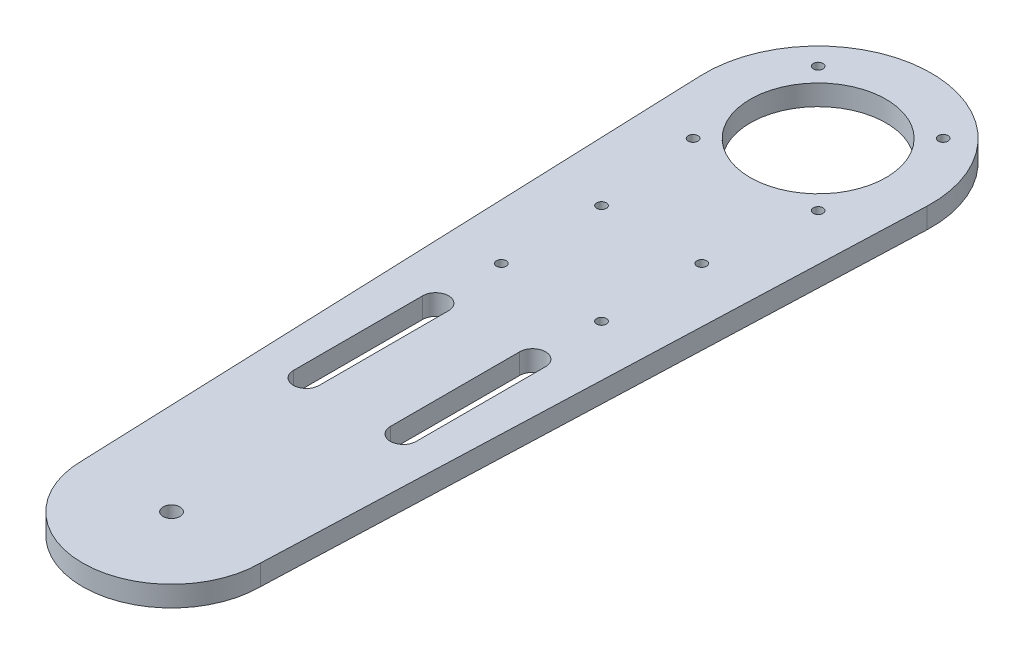
ISO-10303-21;
HEADER;
FILE_DESCRIPTION(('STEP AP214'),'2;1');
FILE_NAME('part.step','',(''),(''),'','','');
FILE_SCHEMA(('AUTOMOTIVE_DESIGN { 1 0 10303 214 1 1 1 1 }'));
ENDSEC;
DATA;
#1=APPLICATION_CONTEXT('core data for automotive mechanical design processes');
#2=APPLICATION_PROTOCOL_DEFINITION('international standard','automotive_design',2000,#1);
#3=PRODUCT_CONTEXT('',#1,'mechanical');
#4=PRODUCT('Part','Part','',(#3));
#5=PRODUCT_RELATED_PRODUCT_CATEGORY('part','',(#4));
#6=PRODUCT_DEFINITION_FORMATION('','',#4);
#7=PRODUCT_DEFINITION_CONTEXT('part definition',#1,'design');
#8=PRODUCT_DEFINITION('design','',#6,#7);
#9=PRODUCT_DEFINITION_SHAPE('','',#8);
#10=(LENGTH_UNIT() NAMED_UNIT(*) SI_UNIT(.MILLI.,.METRE.));
#11=(NAMED_UNIT(*) PLANE_ANGLE_UNIT() SI_UNIT($,.RADIAN.));
#12=(NAMED_UNIT(*) SI_UNIT($,.STERADIAN.) SOLID_ANGLE_UNIT());
#13=UNCERTAINTY_MEASURE_WITH_UNIT(LENGTH_MEASURE(1.E-05),#10,'distance_accuracy_value','');
#14=(GEOMETRIC_REPRESENTATION_CONTEXT(3) GLOBAL_UNCERTAINTY_ASSIGNED_CONTEXT((#13)) GLOBAL_UNIT_ASSIGNED_CONTEXT((#10,
#11,#12)) REPRESENTATION_CONTEXT('',''));
#15=CARTESIAN_POINT('',(0.,0.,0.));
#16=DIRECTION('',(0.,0.,1.));
#17=DIRECTION('',(1.,0.,0.));
#18=AXIS2_PLACEMENT_3D('',#15,#16,#17);
#19=CARTESIAN_POINT('',(27.4611273571522,6.35,1.03319242929476));
#20=DIRECTION('',(-0.999292974733131,0.,-0.0375972159741946));
#21=DIRECTION('',(-0.0375972159741946,0.,0.999292974733131));
#22=AXIS2_PLACEMENT_3D('',#19,#20,#21);
#23=PLANE('',#22);
#24=DIRECTION('',(0.0375972159741946,0.,-0.999292974733131));
#25=VECTOR('',#24,1.);
#26=CARTESIAN_POINT('',(27.4611273571522,0.,1.03319242929476));
#27=LINE('',#26,#25);
#28=CARTESIAN_POINT('',(27.5,0.,0.));
#29=VERTEX_POINT('',#28);
#30=CARTESIAN_POINT('',(34.9752541156596,0.,-198.684097440903));
#31=VERTEX_POINT('',#30);
#32=EDGE_CURVE('E271',#29,#31,#27,.T.);
#33=ORIENTED_EDGE('',*,*,#32,.T.);
#34=DIRECTION('',(0.,-1.,0.));
#35=VECTOR('',#34,1.);
#36=CARTESIAN_POINT('',(34.9752541156596,6.35,-198.684097440903));
#37=LINE('',#36,#35);
#38=CARTESIAN_POINT('',(34.9752541156596,6.35,-198.684097440903));
#39=VERTEX_POINT('',#38);
#40=EDGE_CURVE('E11',#39,#31,#37,.T.);
#41=ORIENTED_EDGE('',*,*,#40,.F.);
#42=DIRECTION('',(0.0375972159741946,0.,-0.999292974733131));
#43=VECTOR('',#42,1.);
#44=CARTESIAN_POINT('',(27.4611273571522,6.35,1.03319242929476));
#45=LINE('',#44,#43);
#46=CARTESIAN_POINT('',(27.5,6.35,0.));
#47=VERTEX_POINT('',#46);
#48=EDGE_CURVE('E275',#47,#39,#45,.T.);
#49=ORIENTED_EDGE('',*,*,#48,.F.);
#50=DIRECTION('',(0.,-1.,0.));
#51=VECTOR('',#50,1.);
#52=CARTESIAN_POINT('',(27.5,6.35,0.));
#53=LINE('',#52,#51);
#54=EDGE_CURVE('E290',#47,#29,#53,.T.);
#55=ORIENTED_EDGE('',*,*,#54,.T.);
#56=EDGE_LOOP('',(#33,#41,#49,#55));
#57=FACE_BOUND('',#56,.T.);
#58=ADVANCED_FACE('F40',(#57),#23,.F.);
#59=CARTESIAN_POINT('',(0.,6.35,-200.));
#60=DIRECTION('',(0.,-1.,0.));
#61=DIRECTION('',(0.,0.,-1.));
#62=AXIS2_PLACEMENT_3D('',#59,#60,#61);
#63=CYLINDRICAL_SURFACE('',#62,35.);
#64=CARTESIAN_POINT('',(0.,0.,-200.));
#65=DIRECTION('',(0.,1.,0.));
#66=DIRECTION('',(0.,0.,1.));
#67=AXIS2_PLACEMENT_3D('',#64,#65,#66);
#68=CIRCLE('',#67,35.);
#69=CARTESIAN_POINT('',(-34.9752541156596,0.,-198.684097440903));
#70=VERTEX_POINT('',#69);
#71=EDGE_CURVE('E294',#31,#70,#68,.T.);
#72=ORIENTED_EDGE('',*,*,#71,.T.);
#73=DIRECTION('',(0.,-1.,0.));
#74=VECTOR('',#73,1.);
#75=CARTESIAN_POINT('',(-34.9752541156596,6.35,-198.684097440903));
#76=LINE('',#75,#74);
#77=CARTESIAN_POINT('',(-34.9752541156596,6.35,-198.684097440903));
#78=VERTEX_POINT('',#77);
#79=EDGE_CURVE('E48',#78,#70,#76,.T.);
#80=ORIENTED_EDGE('',*,*,#79,.F.);
#81=CARTESIAN_POINT('',(0.,6.35,-200.));
#82=DIRECTION('',(0.,1.,0.));
#83=DIRECTION('',(0.,0.,1.));
#84=AXIS2_PLACEMENT_3D('',#81,#82,#83);
#85=CIRCLE('',#84,35.);
#86=EDGE_CURVE('E279',#39,#78,#85,.T.);
#87=ORIENTED_EDGE('',*,*,#86,.F.);
#88=ORIENTED_EDGE('',*,*,#40,.T.);
#89=EDGE_LOOP('',(#72,#80,#87,#88));
#90=FACE_BOUND('',#89,.T.);
#91=ADVANCED_FACE('F316',(#90),#63,.T.);
#92=CARTESIAN_POINT('',(-27.4611273571522,6.35,1.03319242929476));
#93=DIRECTION('',(-0.999292974733131,0.,0.0375972159741946));
#94=DIRECTION('',(0.0375972159741946,0.,0.999292974733131));
#95=AXIS2_PLACEMENT_3D('',#92,#93,#94);
#96=PLANE('',#95);
#97=DIRECTION('',(-0.0375972159741946,0.,-0.999292974733131));
#98=VECTOR('',#97,1.);
#99=CARTESIAN_POINT('',(-27.4611273571522,0.,1.03319242929476));
#100=LINE('',#99,#98);
#101=CARTESIAN_POINT('',(-27.5,0.,0.));
#102=VERTEX_POINT('',#101);
#103=EDGE_CURVE('E298',#102,#70,#100,.T.);
#104=ORIENTED_EDGE('',*,*,#103,.F.);
#105=DIRECTION('',(0.,-1.,0.));
#106=VECTOR('',#105,1.);
#107=CARTESIAN_POINT('',(-27.5,6.35,0.));
#108=LINE('',#107,#106);
#109=CARTESIAN_POINT('',(-27.5,6.35,0.));
#110=VERTEX_POINT('',#109);
#111=EDGE_CURVE('E307',#110,#102,#108,.T.);
#112=ORIENTED_EDGE('',*,*,#111,.F.);
#113=DIRECTION('',(-0.0375972159741946,0.,-0.999292974733131));
#114=VECTOR('',#113,1.);
#115=CARTESIAN_POINT('',(-27.4611273571522,6.35,1.03319242929476));
#116=LINE('',#115,#114);
#117=EDGE_CURVE('E283',#110,#78,#116,.T.);
#118=ORIENTED_EDGE('',*,*,#117,.T.);
#119=ORIENTED_EDGE('',*,*,#79,.T.);
#120=EDGE_LOOP('',(#104,#112,#118,#119));
#121=FACE_BOUND('',#120,.T.);
#122=ADVANCED_FACE('F313',(#121),#96,.T.);
#123=CARTESIAN_POINT('',(0.,6.35,0.));
#124=DIRECTION('',(0.,-1.,0.));
#125=DIRECTION('',(0.,0.,-1.));
#126=AXIS2_PLACEMENT_3D('',#123,#124,#125);
#127=CYLINDRICAL_SURFACE('',#126,27.5);
#128=CARTESIAN_POINT('',(0.,0.,0.));
#129=DIRECTION('',(0.,1.,0.));
#130=DIRECTION('',(0.,0.,1.));
#131=AXIS2_PLACEMENT_3D('',#128,#129,#130);
#132=CIRCLE('',#131,27.5);
#133=EDGE_CURVE('E280',#102,#29,#132,.T.);
#134=ORIENTED_EDGE('',*,*,#133,.T.);
#135=ORIENTED_EDGE('',*,*,#54,.F.);
#136=CARTESIAN_POINT('',(0.,6.35,0.));
#137=DIRECTION('',(0.,1.,0.));
#138=DIRECTION('',(0.,0.,1.));
#139=AXIS2_PLACEMENT_3D('',#136,#137,#138);
#140=CIRCLE('',#139,27.5);
#141=EDGE_CURVE('E287',#110,#47,#140,.T.);
#142=ORIENTED_EDGE('',*,*,#141,.F.);
#143=ORIENTED_EDGE('',*,*,#111,.T.);
#144=EDGE_LOOP('',(#134,#135,#142,#143));
#145=FACE_BOUND('',#144,.T.);
#146=ADVANCED_FACE('F323',(#145),#127,.T.);
#147=CARTESIAN_POINT('',(0.,6.35,0.));
#148=DIRECTION('',(0.,1.,0.));
#149=DIRECTION('',(0.,0.,1.));
#150=AXIS2_PLACEMENT_3D('',#147,#148,#149);
#151=PLANE('',#150);
#152=CARTESIAN_POINT('',(-15.5,6.35,-117.5));
#153=DIRECTION('',(0.,-1.,0.));
#154=DIRECTION('',(0.,0.,-1.));
#155=AXIS2_PLACEMENT_3D('',#152,#153,#154);
#156=CIRCLE('',#155,1.5);
#157=CARTESIAN_POINT('',(-15.5,6.35,-119.));
#158=VERTEX_POINT('',#157);
#159=EDGE_CURVE('E544',#158,#158,#156,.T.);
#160=ORIENTED_EDGE('',*,*,#159,.T.);
#161=EDGE_LOOP('',(#160));
#162=FACE_BOUND('',#161,.T.);
#163=CARTESIAN_POINT('',(-15.5,6.35,-148.5));
#164=DIRECTION('',(0.,-1.,0.));
#165=DIRECTION('',(0.,0.,-1.));
#166=AXIS2_PLACEMENT_3D('',#163,#164,#165);
#167=CIRCLE('',#166,1.5);
#168=CARTESIAN_POINT('',(-15.5,6.35,-150.));
#169=VERTEX_POINT('',#168);
#170=EDGE_CURVE('E571',#169,#169,#167,.T.);
#171=ORIENTED_EDGE('',*,*,#170,.T.);
#172=EDGE_LOOP('',(#171));
#173=FACE_BOUND('',#172,.T.);
#174=CARTESIAN_POINT('',(15.5,6.35,-148.5));
#175=DIRECTION('',(0.,-1.,0.));
#176=DIRECTION('',(0.,0.,-1.));
#177=AXIS2_PLACEMENT_3D('',#174,#175,#176);
#178=CIRCLE('',#177,1.5);
#179=CARTESIAN_POINT('',(15.5,6.35,-150.));
#180=VERTEX_POINT('',#179);
#181=EDGE_CURVE('E560',#180,#180,#178,.T.);
#182=ORIENTED_EDGE('',*,*,#181,.T.);
#183=EDGE_LOOP('',(#182));
#184=FACE_BOUND('',#183,.T.);
#185=CARTESIAN_POINT('',(15.5,6.35,-117.5));
#186=DIRECTION('',(0.,-1.,0.));
#187=DIRECTION('',(0.,0.,-1.));
#188=AXIS2_PLACEMENT_3D('',#185,#186,#187);
#189=CIRCLE('',#188,1.5);
#190=CARTESIAN_POINT('',(15.5,6.35,-119.));
#191=VERTEX_POINT('',#190);
#192=EDGE_CURVE('E206',#191,#191,#189,.T.);
#193=ORIENTED_EDGE('',*,*,#192,.T.);
#194=EDGE_LOOP('',(#193));
#195=FACE_BOUND('',#194,.T.);
#196=CARTESIAN_POINT('',(-15.,6.35,-56.6999999999999));
#197=DIRECTION('',(0.,1.,0.));
#198=DIRECTION('',(0.,0.,1.));
#199=AXIS2_PLACEMENT_3D('',#196,#197,#198);
#200=CIRCLE('',#199,4.00000000000001);
#201=CARTESIAN_POINT('',(-19.,6.35,-56.6999999999999));
#202=VERTEX_POINT('',#201);
#203=CARTESIAN_POINT('',(-11.,6.35,-56.6999999999999));
#204=VERTEX_POINT('',#203);
#205=EDGE_CURVE('E55',#202,#204,#200,.T.);
#206=ORIENTED_EDGE('',*,*,#205,.F.);
#207=DIRECTION('',(0.,0.,1.));
#208=VECTOR('',#207,1.);
#209=CARTESIAN_POINT('',(-19.,6.35,-56.6999999999999));
#210=LINE('',#209,#208);
#211=CARTESIAN_POINT('',(-19.,6.35,-96.6999999999999));
#212=VERTEX_POINT('',#211);
#213=EDGE_CURVE('E153',#212,#202,#210,.T.);
#214=ORIENTED_EDGE('',*,*,#213,.F.);
#215=CARTESIAN_POINT('',(-15.,6.35,-96.6999999999999));
#216=DIRECTION('',(0.,1.,0.));
#217=DIRECTION('',(0.,0.,1.));
#218=AXIS2_PLACEMENT_3D('',#215,#216,#217);
#219=CIRCLE('',#218,4.00000000000001);
#220=CARTESIAN_POINT('',(-11.,6.35,-96.6999999999999));
#221=VERTEX_POINT('',#220);
#222=EDGE_CURVE('E157',#221,#212,#219,.T.);
#223=ORIENTED_EDGE('',*,*,#222,.F.);
#224=DIRECTION('',(0.,0.,-1.));
#225=VECTOR('',#224,1.);
#226=CARTESIAN_POINT('',(-11.,6.35,-56.6999999999999));
#227=LINE('',#226,#225);
#228=EDGE_CURVE('E169',#204,#221,#227,.T.);
#229=ORIENTED_EDGE('',*,*,#228,.F.);
#230=EDGE_LOOP('',(#206,#214,#223,#229));
#231=FACE_BOUND('',#230,.T.);
#232=CARTESIAN_POINT('',(15.,6.35,-56.6999999999999));
#233=DIRECTION('',(0.,1.,0.));
#234=DIRECTION('',(0.,0.,1.));
#235=AXIS2_PLACEMENT_3D('',#232,#233,#234);
#236=CIRCLE('',#235,3.99999999999999);
#237=CARTESIAN_POINT('',(11.,6.35,-56.6999999999999));
#238=VERTEX_POINT('',#237);
#239=CARTESIAN_POINT('',(19.,6.35,-56.6999999999999));
#240=VERTEX_POINT('',#239);
#241=EDGE_CURVE('E63',#238,#240,#236,.T.);
#242=ORIENTED_EDGE('',*,*,#241,.F.);
#243=DIRECTION('',(0.,0.,1.));
#244=VECTOR('',#243,1.);
#245=CARTESIAN_POINT('',(11.,6.35,-56.6999999999999));
#246=LINE('',#245,#244);
#247=CARTESIAN_POINT('',(11.,6.35,-96.6999999999999));
#248=VERTEX_POINT('',#247);
#249=EDGE_CURVE('E190',#248,#238,#246,.T.);
#250=ORIENTED_EDGE('',*,*,#249,.F.);
#251=CARTESIAN_POINT('',(15.,6.35,-96.6999999999999));
#252=DIRECTION('',(0.,1.,0.));
#253=DIRECTION('',(0.,0.,1.));
#254=AXIS2_PLACEMENT_3D('',#251,#252,#253);
#255=CIRCLE('',#254,3.99999999999999);
#256=CARTESIAN_POINT('',(19.,6.35,-96.6999999999999));
#257=VERTEX_POINT('',#256);
#258=EDGE_CURVE('E210',#257,#248,#255,.T.);
#259=ORIENTED_EDGE('',*,*,#258,.F.);
#260=DIRECTION('',(0.,0.,-1.));
#261=VECTOR('',#260,1.);
#262=CARTESIAN_POINT('',(19.,6.35,-56.6999999999999));
#263=LINE('',#262,#261);
#264=EDGE_CURVE('E205',#240,#257,#263,.T.);
#265=ORIENTED_EDGE('',*,*,#264,.F.);
#266=EDGE_LOOP('',(#242,#250,#259,#265));
#267=FACE_BOUND('',#266,.T.);
#268=CARTESIAN_POINT('',(-19.3393704654521,6.35,-180.660629534548));
#269=DIRECTION('',(0.,1.,0.));
#270=DIRECTION('',(0.,0.,1.));
#271=AXIS2_PLACEMENT_3D('',#268,#269,#270);
#272=CIRCLE('',#271,1.5);
#273=CARTESIAN_POINT('',(-19.3393704654521,6.35,-179.160629534548));
#274=VERTEX_POINT('',#273);
#275=EDGE_CURVE('E179',#274,#274,#272,.T.);
#276=ORIENTED_EDGE('',*,*,#275,.F.);
#277=EDGE_LOOP('',(#276));
#278=FACE_BOUND('',#277,.T.);
#279=CARTESIAN_POINT('',(19.3393704654521,6.35,-180.660629534548));
#280=DIRECTION('',(0.,1.,0.));
#281=DIRECTION('',(0.,0.,1.));
#282=AXIS2_PLACEMENT_3D('',#279,#280,#281);
#283=CIRCLE('',#282,1.5);
#284=CARTESIAN_POINT('',(19.3393704654521,6.35,-179.160629534548));
#285=VERTEX_POINT('',#284);
#286=EDGE_CURVE('E240',#285,#285,#283,.T.);
#287=ORIENTED_EDGE('',*,*,#286,.F.);
#288=EDGE_LOOP('',(#287));
#289=FACE_BOUND('',#288,.T.);
#290=CARTESIAN_POINT('',(19.3393704654521,6.35,-219.339370465452));
#291=DIRECTION('',(0.,1.,0.));
#292=DIRECTION('',(0.,0.,1.));
#293=AXIS2_PLACEMENT_3D('',#290,#291,#292);
#294=CIRCLE('',#293,1.5);
#295=CARTESIAN_POINT('',(19.3393704654521,6.35,-217.839370465452));
#296=VERTEX_POINT('',#295);
#297=EDGE_CURVE('E232',#296,#296,#294,.T.);
#298=ORIENTED_EDGE('',*,*,#297,.F.);
#299=EDGE_LOOP('',(#298));
#300=FACE_BOUND('',#299,.T.);
#301=CARTESIAN_POINT('',(-19.3393704654521,6.35,-219.339370465452));
#302=DIRECTION('',(0.,1.,0.));
#303=DIRECTION('',(0.,0.,1.));
#304=AXIS2_PLACEMENT_3D('',#301,#302,#303);
#305=CIRCLE('',#304,1.5);
#306=CARTESIAN_POINT('',(-19.3393704654521,6.35,-217.839370465452));
#307=VERTEX_POINT('',#306);
#308=EDGE_CURVE('E231',#307,#307,#305,.T.);
#309=ORIENTED_EDGE('',*,*,#308,.F.);
#310=EDGE_LOOP('',(#309));
#311=FACE_BOUND('',#310,.T.);
#312=CARTESIAN_POINT('',(0.,6.35,-200.));
#313=DIRECTION('',(0.,1.,0.));
#314=DIRECTION('',(0.,0.,1.));
#315=AXIS2_PLACEMENT_3D('',#312,#313,#314);
#316=CIRCLE('',#315,21.);
#317=CARTESIAN_POINT('',(0.,6.35,-179.));
#318=VERTEX_POINT('',#317);
#319=EDGE_CURVE('E255',#318,#318,#316,.T.);
#320=ORIENTED_EDGE('',*,*,#319,.F.);
#321=EDGE_LOOP('',(#320));
#322=FACE_BOUND('',#321,.T.);
#323=CARTESIAN_POINT('',(0.,6.35,0.));
#324=DIRECTION('',(0.,1.,0.));
#325=DIRECTION('',(0.,0.,1.));
#326=AXIS2_PLACEMENT_3D('',#323,#324,#325);
#327=CIRCLE('',#326,2.6);
#328=CARTESIAN_POINT('',(0.,6.35,2.6));
#329=VERTEX_POINT('',#328);
#330=EDGE_CURVE('E263',#329,#329,#327,.T.);
#331=ORIENTED_EDGE('',*,*,#330,.F.);
#332=EDGE_LOOP('',(#331));
#333=FACE_BOUND('',#332,.T.);
#334=ORIENTED_EDGE('',*,*,#48,.T.);
#335=ORIENTED_EDGE('',*,*,#86,.T.);
#336=ORIENTED_EDGE('',*,*,#117,.F.);
#337=ORIENTED_EDGE('',*,*,#141,.T.);
#338=EDGE_LOOP('',(#334,#335,#336,#337));
#339=FACE_BOUND('',#338,.T.);
#340=ADVANCED_FACE('F328',(#162,#173,#184,#195,#231,#267,#278,#289,#300,#311,#322,#333,#339),
#151,.T.);
#341=CARTESIAN_POINT('',(0.,0.,0.));
#342=DIRECTION('',(0.,1.,0.));
#343=DIRECTION('',(0.,0.,1.));
#344=AXIS2_PLACEMENT_3D('',#341,#342,#343);
#345=PLANE('',#344);
#346=CARTESIAN_POINT('',(-15.5,0.,-117.5));
#347=DIRECTION('',(0.,-1.,0.));
#348=DIRECTION('',(0.,0.,-1.));
#349=AXIS2_PLACEMENT_3D('',#346,#347,#348);
#350=CIRCLE('',#349,1.5);
#351=CARTESIAN_POINT('',(-15.5,0.,-119.));
#352=VERTEX_POINT('',#351);
#353=EDGE_CURVE('E547',#352,#352,#350,.T.);
#354=ORIENTED_EDGE('',*,*,#353,.F.);
#355=EDGE_LOOP('',(#354));
#356=FACE_BOUND('',#355,.T.);
#357=CARTESIAN_POINT('',(-15.5,0.,-148.5));
#358=DIRECTION('',(0.,-1.,0.));
#359=DIRECTION('',(0.,0.,-1.));
#360=AXIS2_PLACEMENT_3D('',#357,#358,#359);
#361=CIRCLE('',#360,1.5);
#362=CARTESIAN_POINT('',(-15.5,0.,-150.));
#363=VERTEX_POINT('',#362);
#364=EDGE_CURVE('E551',#363,#363,#361,.T.);
#365=ORIENTED_EDGE('',*,*,#364,.F.);
#366=EDGE_LOOP('',(#365));
#367=FACE_BOUND('',#366,.T.);
#368=CARTESIAN_POINT('',(15.5,0.,-148.5));
#369=DIRECTION('',(0.,-1.,0.));
#370=DIRECTION('',(0.,0.,-1.));
#371=AXIS2_PLACEMENT_3D('',#368,#369,#370);
#372=CIRCLE('',#371,1.5);
#373=CARTESIAN_POINT('',(15.5,0.,-150.));
#374=VERTEX_POINT('',#373);
#375=EDGE_CURVE('E565',#374,#374,#372,.T.);
#376=ORIENTED_EDGE('',*,*,#375,.F.);
#377=EDGE_LOOP('',(#376));
#378=FACE_BOUND('',#377,.T.);
#379=CARTESIAN_POINT('',(15.5,0.,-117.5));
#380=DIRECTION('',(0.,-1.,0.));
#381=DIRECTION('',(0.,0.,-1.));
#382=AXIS2_PLACEMENT_3D('',#379,#380,#381);
#383=CIRCLE('',#382,1.5);
#384=CARTESIAN_POINT('',(15.5,0.,-119.));
#385=VERTEX_POINT('',#384);
#386=EDGE_CURVE('E160',#385,#385,#383,.T.);
#387=ORIENTED_EDGE('',*,*,#386,.F.);
#388=EDGE_LOOP('',(#387));
#389=FACE_BOUND('',#388,.T.);
#390=DIRECTION('',(0.,0.,1.));
#391=VECTOR('',#390,1.);
#392=CARTESIAN_POINT('',(-19.,0.,-56.6999999999999));
#393=LINE('',#392,#391);
#394=CARTESIAN_POINT('',(-19.,0.,-96.6999999999999));
#395=VERTEX_POINT('',#394);
#396=CARTESIAN_POINT('',(-19.,0.,-56.6999999999999));
#397=VERTEX_POINT('',#396);
#398=EDGE_CURVE('E138',#395,#397,#393,.T.);
#399=ORIENTED_EDGE('',*,*,#398,.T.);
#400=CARTESIAN_POINT('',(-15.,0.,-56.6999999999999));
#401=DIRECTION('',(0.,1.,0.));
#402=DIRECTION('',(0.,0.,1.));
#403=AXIS2_PLACEMENT_3D('',#400,#401,#402);
#404=CIRCLE('',#403,4.00000000000001);
#405=CARTESIAN_POINT('',(-11.,0.,-56.6999999999999));
#406=VERTEX_POINT('',#405);
#407=EDGE_CURVE('E131',#397,#406,#404,.T.);
#408=ORIENTED_EDGE('',*,*,#407,.T.);
#409=DIRECTION('',(0.,0.,-1.));
#410=VECTOR('',#409,1.);
#411=CARTESIAN_POINT('',(-11.,0.,-56.6999999999999));
#412=LINE('',#411,#410);
#413=CARTESIAN_POINT('',(-11.,0.,-96.6999999999999));
#414=VERTEX_POINT('',#413);
#415=EDGE_CURVE('E142',#406,#414,#412,.T.);
#416=ORIENTED_EDGE('',*,*,#415,.T.);
#417=CARTESIAN_POINT('',(-15.,0.,-96.6999999999999));
#418=DIRECTION('',(0.,1.,0.));
#419=DIRECTION('',(0.,0.,1.));
#420=AXIS2_PLACEMENT_3D('',#417,#418,#419);
#421=CIRCLE('',#420,4.00000000000001);
#422=EDGE_CURVE('E147',#414,#395,#421,.T.);
#423=ORIENTED_EDGE('',*,*,#422,.T.);
#424=EDGE_LOOP('',(#399,#408,#416,#423));
#425=FACE_BOUND('',#424,.T.);
#426=DIRECTION('',(0.,0.,1.));
#427=VECTOR('',#426,1.);
#428=CARTESIAN_POINT('',(11.,0.,-56.6999999999999));
#429=LINE('',#428,#427);
#430=CARTESIAN_POINT('',(11.,0.,-96.6999999999999));
#431=VERTEX_POINT('',#430);
#432=CARTESIAN_POINT('',(11.,0.,-56.6999999999999));
#433=VERTEX_POINT('',#432);
#434=EDGE_CURVE('E198',#431,#433,#429,.T.);
#435=ORIENTED_EDGE('',*,*,#434,.T.);
#436=CARTESIAN_POINT('',(15.,0.,-56.6999999999999));
#437=DIRECTION('',(0.,1.,0.));
#438=DIRECTION('',(0.,0.,1.));
#439=AXIS2_PLACEMENT_3D('',#436,#437,#438);
#440=CIRCLE('',#439,3.99999999999999);
#441=CARTESIAN_POINT('',(19.,0.,-56.6999999999999));
#442=VERTEX_POINT('',#441);
#443=EDGE_CURVE('E185',#433,#442,#440,.T.);
#444=ORIENTED_EDGE('',*,*,#443,.T.);
#445=DIRECTION('',(0.,0.,-1.));
#446=VECTOR('',#445,1.);
#447=CARTESIAN_POINT('',(19.,0.,-56.6999999999999));
#448=LINE('',#447,#446);
#449=CARTESIAN_POINT('',(19.,0.,-96.6999999999999));
#450=VERTEX_POINT('',#449);
#451=EDGE_CURVE('E189',#442,#450,#448,.T.);
#452=ORIENTED_EDGE('',*,*,#451,.T.);
#453=CARTESIAN_POINT('',(15.,0.,-96.6999999999999));
#454=DIRECTION('',(0.,1.,0.));
#455=DIRECTION('',(0.,0.,1.));
#456=AXIS2_PLACEMENT_3D('',#453,#454,#455);
#457=CIRCLE('',#456,3.99999999999999);
#458=EDGE_CURVE('E194',#450,#431,#457,.T.);
#459=ORIENTED_EDGE('',*,*,#458,.T.);
#460=EDGE_LOOP('',(#435,#444,#452,#459));
#461=FACE_BOUND('',#460,.T.);
#462=CARTESIAN_POINT('',(-19.3393704654521,0.,-180.660629534548));
#463=DIRECTION('',(0.,1.,0.));
#464=DIRECTION('',(0.,0.,1.));
#465=AXIS2_PLACEMENT_3D('',#462,#463,#464);
#466=CIRCLE('',#465,1.5);
#467=CARTESIAN_POINT('',(-19.3393704654521,0.,-179.160629534548));
#468=VERTEX_POINT('',#467);
#469=EDGE_CURVE('E244',#468,#468,#466,.T.);
#470=ORIENTED_EDGE('',*,*,#469,.T.);
#471=EDGE_LOOP('',(#470));
#472=FACE_BOUND('',#471,.T.);
#473=CARTESIAN_POINT('',(19.3393704654521,0.,-180.660629534548));
#474=DIRECTION('',(0.,1.,0.));
#475=DIRECTION('',(0.,0.,1.));
#476=AXIS2_PLACEMENT_3D('',#473,#474,#475);
#477=CIRCLE('',#476,1.5);
#478=CARTESIAN_POINT('',(19.3393704654521,0.,-179.160629534548));
#479=VERTEX_POINT('',#478);
#480=EDGE_CURVE('E236',#479,#479,#477,.T.);
#481=ORIENTED_EDGE('',*,*,#480,.T.);
#482=EDGE_LOOP('',(#481));
#483=FACE_BOUND('',#482,.T.);
#484=CARTESIAN_POINT('',(19.3393704654521,0.,-219.339370465452));
#485=DIRECTION('',(0.,1.,0.));
#486=DIRECTION('',(0.,0.,1.));
#487=AXIS2_PLACEMENT_3D('',#484,#485,#486);
#488=CIRCLE('',#487,1.5);
#489=CARTESIAN_POINT('',(19.3393704654521,0.,-217.839370465452));
#490=VERTEX_POINT('',#489);
#491=EDGE_CURVE('E227',#490,#490,#488,.T.);
#492=ORIENTED_EDGE('',*,*,#491,.T.);
#493=EDGE_LOOP('',(#492));
#494=FACE_BOUND('',#493,.T.);
#495=CARTESIAN_POINT('',(-19.3393704654521,0.,-219.339370465452));
#496=DIRECTION('',(0.,1.,0.));
#497=DIRECTION('',(0.,0.,1.));
#498=AXIS2_PLACEMENT_3D('',#495,#496,#497);
#499=CIRCLE('',#498,1.5);
#500=CARTESIAN_POINT('',(-19.3393704654521,0.,-217.839370465452));
#501=VERTEX_POINT('',#500);
#502=EDGE_CURVE('E251',#501,#501,#499,.T.);
#503=ORIENTED_EDGE('',*,*,#502,.T.);
#504=EDGE_LOOP('',(#503));
#505=FACE_BOUND('',#504,.T.);
#506=CARTESIAN_POINT('',(0.,0.,-200.));
#507=DIRECTION('',(0.,1.,0.));
#508=DIRECTION('',(0.,0.,1.));
#509=AXIS2_PLACEMENT_3D('',#506,#507,#508);
#510=CIRCLE('',#509,21.);
#511=CARTESIAN_POINT('',(0.,0.,-179.));
#512=VERTEX_POINT('',#511);
#513=EDGE_CURVE('E259',#512,#512,#510,.T.);
#514=ORIENTED_EDGE('',*,*,#513,.T.);
#515=EDGE_LOOP('',(#514));
#516=FACE_BOUND('',#515,.T.);
#517=CARTESIAN_POINT('',(0.,0.,0.));
#518=DIRECTION('',(0.,1.,0.));
#519=DIRECTION('',(0.,0.,1.));
#520=AXIS2_PLACEMENT_3D('',#517,#518,#519);
#521=CIRCLE('',#520,2.6);
#522=CARTESIAN_POINT('',(0.,0.,2.6));
#523=VERTEX_POINT('',#522);
#524=EDGE_CURVE('E267',#523,#523,#521,.T.);
#525=ORIENTED_EDGE('',*,*,#524,.T.);
#526=EDGE_LOOP('',(#525));
#527=FACE_BOUND('',#526,.T.);
#528=ORIENTED_EDGE('',*,*,#32,.F.);
#529=ORIENTED_EDGE('',*,*,#133,.F.);
#530=ORIENTED_EDGE('',*,*,#103,.T.);
#531=ORIENTED_EDGE('',*,*,#71,.F.);
#532=EDGE_LOOP('',(#528,#529,#530,#531));
#533=FACE_BOUND('',#532,.T.);
#534=ADVANCED_FACE('F149',(#356,#367,#378,#389,#425,#461,#472,#483,#494,#505,#516,#527,#533),
#345,.F.);
#535=CARTESIAN_POINT('',(0.,0.,0.));
#536=DIRECTION('',(0.,1.,0.));
#537=DIRECTION('',(0.,0.,1.));
#538=AXIS2_PLACEMENT_3D('',#535,#536,#537);
#539=CYLINDRICAL_SURFACE('',#538,2.6);
#540=ORIENTED_EDGE('',*,*,#524,.F.);
#541=EDGE_LOOP('',(#540));
#542=FACE_BOUND('',#541,.T.);
#543=ORIENTED_EDGE('',*,*,#330,.T.);
#544=EDGE_LOOP('',(#543));
#545=FACE_BOUND('',#544,.T.);
#546=ADVANCED_FACE('F336',(#542,#545),#539,.F.);
#547=CARTESIAN_POINT('',(0.,0.,-200.));
#548=DIRECTION('',(0.,1.,0.));
#549=DIRECTION('',(0.,0.,1.));
#550=AXIS2_PLACEMENT_3D('',#547,#548,#549);
#551=CYLINDRICAL_SURFACE('',#550,21.);
#552=ORIENTED_EDGE('',*,*,#513,.F.);
#553=EDGE_LOOP('',(#552));
#554=FACE_BOUND('',#553,.T.);
#555=ORIENTED_EDGE('',*,*,#319,.T.);
#556=EDGE_LOOP('',(#555));
#557=FACE_BOUND('',#556,.T.);
#558=ADVANCED_FACE('F376',(#554,#557),#551,.F.);
#559=CARTESIAN_POINT('',(-19.3393704654521,0.,-219.339370465452));
#560=DIRECTION('',(0.,1.,0.));
#561=DIRECTION('',(0.,0.,1.));
#562=AXIS2_PLACEMENT_3D('',#559,#560,#561);
#563=CYLINDRICAL_SURFACE('',#562,1.5);
#564=ORIENTED_EDGE('',*,*,#502,.F.);
#565=EDGE_LOOP('',(#564));
#566=FACE_BOUND('',#565,.T.);
#567=ORIENTED_EDGE('',*,*,#308,.T.);
#568=EDGE_LOOP('',(#567));
#569=FACE_BOUND('',#568,.T.);
#570=ADVANCED_FACE('F382',(#566,#569),#563,.F.);
#571=CARTESIAN_POINT('',(19.3393704654521,0.,-219.339370465452));
#572=DIRECTION('',(0.,1.,0.));
#573=DIRECTION('',(0.,0.,1.));
#574=AXIS2_PLACEMENT_3D('',#571,#572,#573);
#575=CYLINDRICAL_SURFACE('',#574,1.5);
#576=ORIENTED_EDGE('',*,*,#491,.F.);
#577=EDGE_LOOP('',(#576));
#578=FACE_BOUND('',#577,.T.);
#579=ORIENTED_EDGE('',*,*,#297,.T.);
#580=EDGE_LOOP('',(#579));
#581=FACE_BOUND('',#580,.T.);
#582=ADVANCED_FACE('F390',(#578,#581),#575,.F.);
#583=CARTESIAN_POINT('',(19.3393704654521,0.,-180.660629534548));
#584=DIRECTION('',(0.,1.,0.));
#585=DIRECTION('',(0.,0.,1.));
#586=AXIS2_PLACEMENT_3D('',#583,#584,#585);
#587=CYLINDRICAL_SURFACE('',#586,1.5);
#588=ORIENTED_EDGE('',*,*,#480,.F.);
#589=EDGE_LOOP('',(#588));
#590=FACE_BOUND('',#589,.T.);
#591=ORIENTED_EDGE('',*,*,#286,.T.);
#592=EDGE_LOOP('',(#591));
#593=FACE_BOUND('',#592,.T.);
#594=ADVANCED_FACE('F398',(#590,#593),#587,.F.);
#595=CARTESIAN_POINT('',(-19.3393704654521,0.,-180.660629534548));
#596=DIRECTION('',(0.,1.,0.));
#597=DIRECTION('',(0.,0.,1.));
#598=AXIS2_PLACEMENT_3D('',#595,#596,#597);
#599=CYLINDRICAL_SURFACE('',#598,1.5);
#600=ORIENTED_EDGE('',*,*,#469,.F.);
#601=EDGE_LOOP('',(#600));
#602=FACE_BOUND('',#601,.T.);
#603=ORIENTED_EDGE('',*,*,#275,.T.);
#604=EDGE_LOOP('',(#603));
#605=FACE_BOUND('',#604,.T.);
#606=ADVANCED_FACE('F406',(#602,#605),#599,.F.);
#607=CARTESIAN_POINT('',(15.,0.,-56.6999999999999));
#608=DIRECTION('',(0.,1.,0.));
#609=DIRECTION('',(0.,0.,1.));
#610=AXIS2_PLACEMENT_3D('',#607,#608,#609);
#611=CYLINDRICAL_SURFACE('',#610,3.99999999999999);
#612=ORIENTED_EDGE('',*,*,#241,.T.);
#613=DIRECTION('',(0.,1.,0.));
#614=VECTOR('',#613,1.);
#615=CARTESIAN_POINT('',(19.,0.,-56.6999999999999));
#616=LINE('',#615,#614);
#617=EDGE_CURVE('E202',#442,#240,#616,.T.);
#618=ORIENTED_EDGE('',*,*,#617,.F.);
#619=ORIENTED_EDGE('',*,*,#443,.F.);
#620=DIRECTION('',(0.,1.,0.));
#621=VECTOR('',#620,1.);
#622=CARTESIAN_POINT('',(11.,0.,-56.6999999999999));
#623=LINE('',#622,#621);
#624=EDGE_CURVE('E170',#433,#238,#623,.T.);
#625=ORIENTED_EDGE('',*,*,#624,.T.);
#626=EDGE_LOOP('',(#612,#618,#619,#625));
#627=FACE_BOUND('',#626,.T.);
#628=ADVANCED_FACE('F414',(#627),#611,.F.);
#629=CARTESIAN_POINT('',(11.,0.,-56.6999999999999));
#630=DIRECTION('',(-1.,0.,0.));
#631=DIRECTION('',(0.,0.,1.));
#632=AXIS2_PLACEMENT_3D('',#629,#630,#631);
#633=PLANE('',#632);
#634=ORIENTED_EDGE('',*,*,#249,.T.);
#635=ORIENTED_EDGE('',*,*,#624,.F.);
#636=ORIENTED_EDGE('',*,*,#434,.F.);
#637=DIRECTION('',(0.,1.,0.));
#638=VECTOR('',#637,1.);
#639=CARTESIAN_POINT('',(11.,0.,-96.6999999999999));
#640=LINE('',#639,#638);
#641=EDGE_CURVE('E219',#431,#248,#640,.T.);
#642=ORIENTED_EDGE('',*,*,#641,.T.);
#643=EDGE_LOOP('',(#634,#635,#636,#642));
#644=FACE_BOUND('',#643,.T.);
#645=ADVANCED_FACE('F422',(#644),#633,.F.);
#646=CARTESIAN_POINT('',(15.,0.,-96.6999999999999));
#647=DIRECTION('',(0.,1.,0.));
#648=DIRECTION('',(0.,0.,1.));
#649=AXIS2_PLACEMENT_3D('',#646,#647,#648);
#650=CYLINDRICAL_SURFACE('',#649,3.99999999999999);
#651=ORIENTED_EDGE('',*,*,#258,.T.);
#652=ORIENTED_EDGE('',*,*,#641,.F.);
#653=ORIENTED_EDGE('',*,*,#458,.F.);
#654=DIRECTION('',(0.,1.,0.));
#655=VECTOR('',#654,1.);
#656=CARTESIAN_POINT('',(19.,0.,-96.6999999999999));
#657=LINE('',#656,#655);
#658=EDGE_CURVE('E222',#450,#257,#657,.T.);
#659=ORIENTED_EDGE('',*,*,#658,.T.);
#660=EDGE_LOOP('',(#651,#652,#653,#659));
#661=FACE_BOUND('',#660,.T.);
#662=ADVANCED_FACE('F429',(#661),#650,.F.);
#663=CARTESIAN_POINT('',(19.,0.,-56.6999999999999));
#664=DIRECTION('',(1.,0.,0.));
#665=DIRECTION('',(0.,0.,-1.));
#666=AXIS2_PLACEMENT_3D('',#663,#664,#665);
#667=PLANE('',#666);
#668=ORIENTED_EDGE('',*,*,#264,.T.);
#669=ORIENTED_EDGE('',*,*,#658,.F.);
#670=ORIENTED_EDGE('',*,*,#451,.F.);
#671=ORIENTED_EDGE('',*,*,#617,.T.);
#672=EDGE_LOOP('',(#668,#669,#670,#671));
#673=FACE_BOUND('',#672,.T.);
#674=ADVANCED_FACE('F437',(#673),#667,.F.);
#675=CARTESIAN_POINT('',(-15.,0.,-56.6999999999999));
#676=DIRECTION('',(0.,1.,0.));
#677=DIRECTION('',(0.,0.,1.));
#678=AXIS2_PLACEMENT_3D('',#675,#676,#677);
#679=CYLINDRICAL_SURFACE('',#678,4.00000000000001);
#680=ORIENTED_EDGE('',*,*,#205,.T.);
#681=DIRECTION('',(0.,1.,0.));
#682=VECTOR('',#681,1.);
#683=CARTESIAN_POINT('',(-11.,0.,-56.6999999999999));
#684=LINE('',#683,#682);
#685=EDGE_CURVE('E127',#406,#204,#684,.T.);
#686=ORIENTED_EDGE('',*,*,#685,.F.);
#687=ORIENTED_EDGE('',*,*,#407,.F.);
#688=DIRECTION('',(0.,1.,0.));
#689=VECTOR('',#688,1.);
#690=CARTESIAN_POINT('',(-19.,0.,-56.6999999999999));
#691=LINE('',#690,#689);
#692=EDGE_CURVE('E176',#397,#202,#691,.T.);
#693=ORIENTED_EDGE('',*,*,#692,.T.);
#694=EDGE_LOOP('',(#680,#686,#687,#693));
#695=FACE_BOUND('',#694,.T.);
#696=ADVANCED_FACE('F129',(#695),#679,.F.);
#697=CARTESIAN_POINT('',(-19.,0.,-56.6999999999999));
#698=DIRECTION('',(-1.,0.,0.));
#699=DIRECTION('',(0.,0.,1.));
#700=AXIS2_PLACEMENT_3D('',#697,#698,#699);
#701=PLANE('',#700);
#702=ORIENTED_EDGE('',*,*,#213,.T.);
#703=ORIENTED_EDGE('',*,*,#692,.F.);
#704=ORIENTED_EDGE('',*,*,#398,.F.);
#705=DIRECTION('',(0.,1.,0.));
#706=VECTOR('',#705,1.);
#707=CARTESIAN_POINT('',(-19.,0.,-96.6999999999999));
#708=LINE('',#707,#706);
#709=EDGE_CURVE('E180',#395,#212,#708,.T.);
#710=ORIENTED_EDGE('',*,*,#709,.T.);
#711=EDGE_LOOP('',(#702,#703,#704,#710));
#712=FACE_BOUND('',#711,.T.);
#713=ADVANCED_FACE('F452',(#712),#701,.F.);
#714=CARTESIAN_POINT('',(-15.,0.,-96.6999999999999));
#715=DIRECTION('',(0.,1.,0.));
#716=DIRECTION('',(0.,0.,1.));
#717=AXIS2_PLACEMENT_3D('',#714,#715,#716);
#718=CYLINDRICAL_SURFACE('',#717,4.00000000000001);
#719=ORIENTED_EDGE('',*,*,#222,.T.);
#720=ORIENTED_EDGE('',*,*,#709,.F.);
#721=ORIENTED_EDGE('',*,*,#422,.F.);
#722=DIRECTION('',(0.,1.,0.));
#723=VECTOR('',#722,1.);
#724=CARTESIAN_POINT('',(-11.,0.,-96.6999999999999));
#725=LINE('',#724,#723);
#726=EDGE_CURVE('E137',#414,#221,#725,.T.);
#727=ORIENTED_EDGE('',*,*,#726,.T.);
#728=EDGE_LOOP('',(#719,#720,#721,#727));
#729=FACE_BOUND('',#728,.T.);
#730=ADVANCED_FACE('F459',(#729),#718,.F.);
#731=CARTESIAN_POINT('',(-11.,0.,-56.6999999999999));
#732=DIRECTION('',(1.,0.,0.));
#733=DIRECTION('',(0.,0.,-1.));
#734=AXIS2_PLACEMENT_3D('',#731,#732,#733);
#735=PLANE('',#734);
#736=ORIENTED_EDGE('',*,*,#228,.T.);
#737=ORIENTED_EDGE('',*,*,#726,.F.);
#738=ORIENTED_EDGE('',*,*,#415,.F.);
#739=ORIENTED_EDGE('',*,*,#685,.T.);
#740=EDGE_LOOP('',(#736,#737,#738,#739));
#741=FACE_BOUND('',#740,.T.);
#742=ADVANCED_FACE('F143',(#741),#735,.F.);
#743=CARTESIAN_POINT('',(15.5,6.35,-117.5));
#744=DIRECTION('',(0.,-1.,0.));
#745=DIRECTION('',(0.,0.,-1.));
#746=AXIS2_PLACEMENT_3D('',#743,#744,#745);
#747=CYLINDRICAL_SURFACE('',#746,1.5);
#748=ORIENTED_EDGE('',*,*,#192,.F.);
#749=EDGE_LOOP('',(#748));
#750=FACE_BOUND('',#749,.T.);
#751=ORIENTED_EDGE('',*,*,#386,.T.);
#752=EDGE_LOOP('',(#751));
#753=FACE_BOUND('',#752,.T.);
#754=ADVANCED_FACE('F473',(#750,#753),#747,.F.);
#755=CARTESIAN_POINT('',(15.5,6.35,-148.5));
#756=DIRECTION('',(0.,-1.,0.));
#757=DIRECTION('',(0.,0.,-1.));
#758=AXIS2_PLACEMENT_3D('',#755,#756,#757);
#759=CYLINDRICAL_SURFACE('',#758,1.5);
#760=ORIENTED_EDGE('',*,*,#181,.F.);
#761=EDGE_LOOP('',(#760));
#762=FACE_BOUND('',#761,.T.);
#763=ORIENTED_EDGE('',*,*,#375,.T.);
#764=EDGE_LOOP('',(#763));
#765=FACE_BOUND('',#764,.T.);
#766=ADVANCED_FACE('F479',(#762,#765),#759,.F.);
#767=CARTESIAN_POINT('',(-15.5,6.35,-148.5));
#768=DIRECTION('',(0.,-1.,0.));
#769=DIRECTION('',(0.,0.,-1.));
#770=AXIS2_PLACEMENT_3D('',#767,#768,#769);
#771=CYLINDRICAL_SURFACE('',#770,1.5);
#772=ORIENTED_EDGE('',*,*,#170,.F.);
#773=EDGE_LOOP('',(#772));
#774=FACE_BOUND('',#773,.T.);
#775=ORIENTED_EDGE('',*,*,#364,.T.);
#776=EDGE_LOOP('',(#775));
#777=FACE_BOUND('',#776,.T.);
#778=ADVANCED_FACE('F487',(#774,#777),#771,.F.);
#779=CARTESIAN_POINT('',(-15.5,6.35,-117.5));
#780=DIRECTION('',(0.,-1.,0.));
#781=DIRECTION('',(0.,0.,-1.));
#782=AXIS2_PLACEMENT_3D('',#779,#780,#781);
#783=CYLINDRICAL_SURFACE('',#782,1.5);
#784=ORIENTED_EDGE('',*,*,#159,.F.);
#785=EDGE_LOOP('',(#784));
#786=FACE_BOUND('',#785,.T.);
#787=ORIENTED_EDGE('',*,*,#353,.T.);
#788=EDGE_LOOP('',(#787));
#789=FACE_BOUND('',#788,.T.);
#790=ADVANCED_FACE('F495',(#786,#789),#783,.F.);
#791=CLOSED_SHELL('',(#58,#91,#122,#146,#340,#534,#546,#558,#570,#582,#594,#606,#628,#645,#662,
#674,#696,#713,#730,#742,#754,#766,#778,#790));
#792=MANIFOLD_SOLID_BREP('B2',#791);
#793=ADVANCED_BREP_SHAPE_REPRESENTATION('',(#18,#792),#14);
#794=SHAPE_DEFINITION_REPRESENTATION(#9,#793);
ENDSEC;
END-ISO-10303-21;
